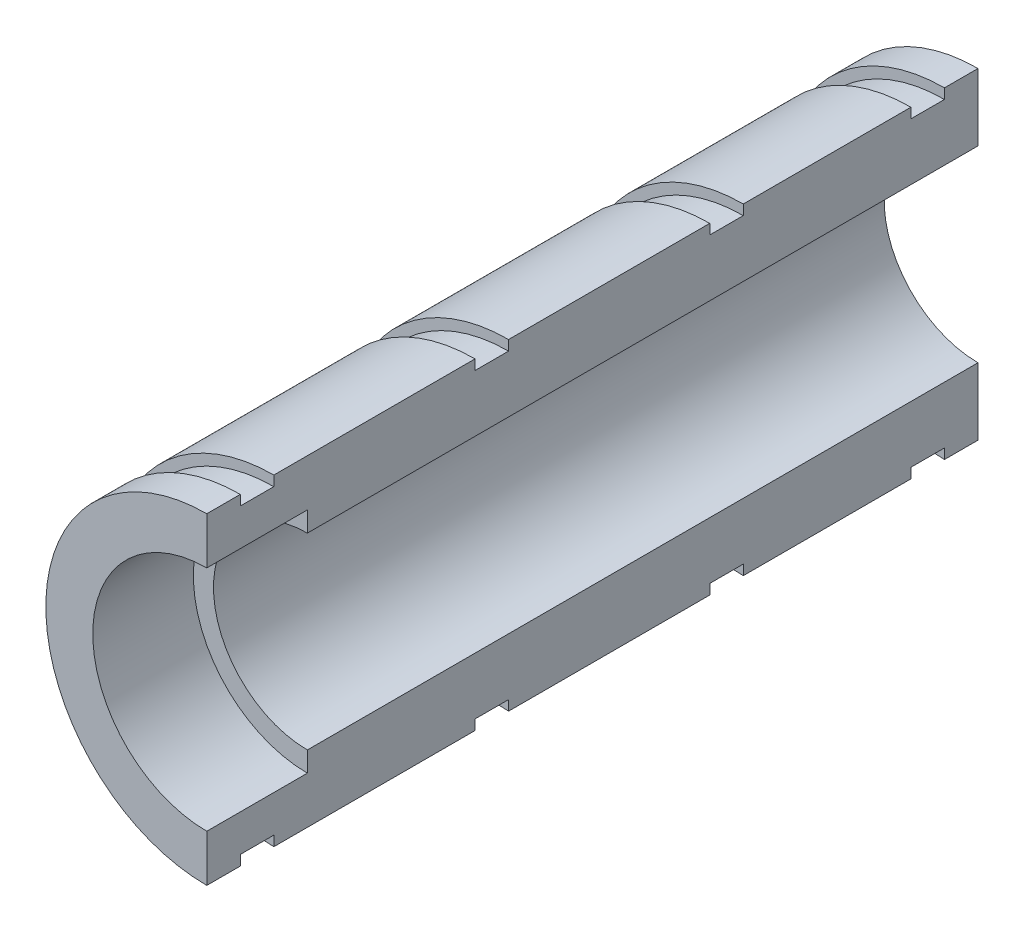
ISO-10303-21;
HEADER;
FILE_DESCRIPTION(('STEP AP214'),'2;1');
FILE_NAME('part.step','',(''),(''),'','','');
FILE_SCHEMA(('AUTOMOTIVE_DESIGN { 1 0 10303 214 1 1 1 1 }'));
ENDSEC;
DATA;
#1=APPLICATION_CONTEXT('core data for automotive mechanical design processes');
#2=APPLICATION_PROTOCOL_DEFINITION('international standard','automotive_design',2000,#1);
#3=PRODUCT_CONTEXT('',#1,'mechanical');
#4=PRODUCT('Part','Part','',(#3));
#5=PRODUCT_RELATED_PRODUCT_CATEGORY('part','',(#4));
#6=PRODUCT_DEFINITION_FORMATION('','',#4);
#7=PRODUCT_DEFINITION_CONTEXT('part definition',#1,'design');
#8=PRODUCT_DEFINITION('design','',#6,#7);
#9=PRODUCT_DEFINITION_SHAPE('','',#8);
#10=(LENGTH_UNIT() NAMED_UNIT(*) SI_UNIT(.MILLI.,.METRE.));
#11=(NAMED_UNIT(*) PLANE_ANGLE_UNIT() SI_UNIT($,.RADIAN.));
#12=(NAMED_UNIT(*) SI_UNIT($,.STERADIAN.) SOLID_ANGLE_UNIT());
#13=UNCERTAINTY_MEASURE_WITH_UNIT(LENGTH_MEASURE(1.E-05),#10,'distance_accuracy_value','');
#14=(GEOMETRIC_REPRESENTATION_CONTEXT(3) GLOBAL_UNCERTAINTY_ASSIGNED_CONTEXT((#13)) GLOBAL_UNIT_ASSIGNED_CONTEXT((#10,
#11,#12)) REPRESENTATION_CONTEXT('',''));
#15=CARTESIAN_POINT('',(0.,0.,0.));
#16=DIRECTION('',(0.,0.,1.));
#17=DIRECTION('',(1.,0.,0.));
#18=AXIS2_PLACEMENT_3D('',#15,#16,#17);
#19=CARTESIAN_POINT('',(0.,0.,115.));
#20=DIRECTION('',(0.,0.,-1.));
#21=DIRECTION('',(-1.,0.,0.));
#22=AXIS2_PLACEMENT_3D('',#19,#20,#21);
#23=CYLINDRICAL_SURFACE('',#22,24.);
#24=CARTESIAN_POINT('',(0.,0.,9.99999999999999));
#25=DIRECTION('',(0.,0.,-1.));
#26=DIRECTION('',(-1.,0.,0.));
#27=AXIS2_PLACEMENT_3D('',#24,#25,#26);
#28=CIRCLE('',#27,24.);
#29=CARTESIAN_POINT('',(0.,-24.,9.99999999999999));
#30=VERTEX_POINT('',#29);
#31=CARTESIAN_POINT('',(0.,24.,9.99999999999999));
#32=VERTEX_POINT('',#31);
#33=EDGE_CURVE('E192',#30,#32,#28,.T.);
#34=ORIENTED_EDGE('',*,*,#33,.F.);
#35=DIRECTION('',(0.,0.,-1.));
#36=VECTOR('',#35,1.);
#37=CARTESIAN_POINT('',(0.,-24.,115.));
#38=LINE('',#37,#36);
#39=CARTESIAN_POINT('',(0.,-24.,35.));
#40=VERTEX_POINT('',#39);
#41=EDGE_CURVE('E333',#30,#40,#38,.F.);
#42=ORIENTED_EDGE('',*,*,#41,.T.);
#43=CARTESIAN_POINT('',(0.,0.,35.));
#44=DIRECTION('',(0.,0.,-1.));
#45=DIRECTION('',(-1.,0.,0.));
#46=AXIS2_PLACEMENT_3D('',#43,#44,#45);
#47=CIRCLE('',#46,24.);
#48=CARTESIAN_POINT('',(0.,24.,35.));
#49=VERTEX_POINT('',#48);
#50=EDGE_CURVE('E285',#40,#49,#47,.T.);
#51=ORIENTED_EDGE('',*,*,#50,.T.);
#52=DIRECTION('',(0.,0.,-1.));
#53=VECTOR('',#52,1.);
#54=CARTESIAN_POINT('',(0.,24.,115.));
#55=LINE('',#54,#53);
#56=EDGE_CURVE('E341',#49,#32,#55,.T.);
#57=ORIENTED_EDGE('',*,*,#56,.T.);
#58=EDGE_LOOP('',(#34,#42,#51,#57));
#59=FACE_BOUND('',#58,.T.);
#60=ADVANCED_FACE('F39',(#59),#23,.T.);
#61=CARTESIAN_POINT('',(0.,0.,105.));
#62=DIRECTION('',(0.,0.,1.));
#63=DIRECTION('',(1.,0.,0.));
#64=AXIS2_PLACEMENT_3D('',#61,#62,#63);
#65=CIRCLE('',#64,24.);
#66=CARTESIAN_POINT('',(0.,24.,105.));
#67=VERTEX_POINT('',#66);
#68=CARTESIAN_POINT('',(0.,-24.,105.));
#69=VERTEX_POINT('',#68);
#70=EDGE_CURVE('E236',#67,#69,#65,.T.);
#71=ORIENTED_EDGE('',*,*,#70,.F.);
#72=CARTESIAN_POINT('',(0.,24.,75.));
#73=VERTEX_POINT('',#72);
#74=EDGE_CURVE('E340',#67,#73,#55,.T.);
#75=ORIENTED_EDGE('',*,*,#74,.T.);
#76=CARTESIAN_POINT('',(0.,0.,75.));
#77=DIRECTION('',(0.,0.,-1.));
#78=DIRECTION('',(-1.,0.,0.));
#79=AXIS2_PLACEMENT_3D('',#76,#77,#78);
#80=CIRCLE('',#79,24.);
#81=CARTESIAN_POINT('',(0.,-24.,75.));
#82=VERTEX_POINT('',#81);
#83=EDGE_CURVE('E268',#82,#73,#80,.T.);
#84=ORIENTED_EDGE('',*,*,#83,.F.);
#85=EDGE_CURVE('E413',#82,#69,#38,.F.);
#86=ORIENTED_EDGE('',*,*,#85,.T.);
#87=EDGE_LOOP('',(#71,#75,#84,#86));
#88=FACE_BOUND('',#87,.T.);
#89=ADVANCED_FACE('F424',(#88),#23,.T.);
#90=CARTESIAN_POINT('',(0.,24.,115.));
#91=VERTEX_POINT('',#90);
#92=CARTESIAN_POINT('',(0.,24.,110.));
#93=VERTEX_POINT('',#92);
#94=EDGE_CURVE('E335',#91,#93,#55,.T.);
#95=ORIENTED_EDGE('',*,*,#94,.T.);
#96=CARTESIAN_POINT('',(0.,0.,110.));
#97=DIRECTION('',(0.,0.,1.));
#98=DIRECTION('',(1.,0.,0.));
#99=AXIS2_PLACEMENT_3D('',#96,#97,#98);
#100=CIRCLE('',#99,24.);
#101=CARTESIAN_POINT('',(0.,-24.,110.));
#102=VERTEX_POINT('',#101);
#103=EDGE_CURVE('E242',#93,#102,#100,.T.);
#104=ORIENTED_EDGE('',*,*,#103,.T.);
#105=CARTESIAN_POINT('',(0.,-24.,115.));
#106=VERTEX_POINT('',#105);
#107=EDGE_CURVE('E327',#102,#106,#38,.F.);
#108=ORIENTED_EDGE('',*,*,#107,.T.);
#109=CARTESIAN_POINT('',(0.,0.,115.));
#110=DIRECTION('',(0.,0.,1.));
#111=DIRECTION('',(1.,0.,0.));
#112=AXIS2_PLACEMENT_3D('',#109,#110,#111);
#113=CIRCLE('',#112,24.);
#114=EDGE_CURVE('E346',#91,#106,#113,.T.);
#115=ORIENTED_EDGE('',*,*,#114,.F.);
#116=EDGE_LOOP('',(#95,#104,#108,#115));
#117=FACE_BOUND('',#116,.T.);
#118=ADVANCED_FACE('F465',(#117),#23,.T.);
#119=CARTESIAN_POINT('',(0.,27.3295987942674,-15.));
#120=DIRECTION('',(-1.,0.,0.));
#121=DIRECTION('',(0.,0.,1.));
#122=AXIS2_PLACEMENT_3D('',#119,#120,#121);
#123=PLANE('',#122);
#124=DIRECTION('',(0.,0.,1.));
#125=VECTOR('',#124,1.);
#126=CARTESIAN_POINT('',(0.,-22.5,5.));
#127=LINE('',#126,#125);
#128=CARTESIAN_POINT('',(0.,-22.5,10.));
#129=VERTEX_POINT('',#128);
#130=CARTESIAN_POINT('',(0.,-22.5,5.));
#131=VERTEX_POINT('',#130);
#132=EDGE_CURVE('E204',#129,#131,#127,.F.);
#133=ORIENTED_EDGE('',*,*,#132,.T.);
#134=DIRECTION('',(0.,-1.,0.));
#135=VECTOR('',#134,1.);
#136=CARTESIAN_POINT('',(0.,27.3295987942674,5.));
#137=LINE('',#136,#135);
#138=CARTESIAN_POINT('',(0.,-24.,5.));
#139=VERTEX_POINT('',#138);
#140=EDGE_CURVE('E216',#131,#139,#137,.T.);
#141=ORIENTED_EDGE('',*,*,#140,.T.);
#142=CARTESIAN_POINT('',(0.,-24.,0.));
#143=VERTEX_POINT('',#142);
#144=EDGE_CURVE('E329',#143,#139,#38,.F.);
#145=ORIENTED_EDGE('',*,*,#144,.F.);
#146=DIRECTION('',(0.,-1.,0.));
#147=VECTOR('',#146,1.);
#148=CARTESIAN_POINT('',(0.,0.,0.));
#149=LINE('',#148,#147);
#150=CARTESIAN_POINT('',(0.,-14.,0.));
#151=VERTEX_POINT('',#150);
#152=EDGE_CURVE('E323',#151,#143,#149,.T.);
#153=ORIENTED_EDGE('',*,*,#152,.F.);
#154=DIRECTION('',(0.,0.,-1.));
#155=VECTOR('',#154,1.);
#156=CARTESIAN_POINT('',(0.,-14.,115.));
#157=LINE('',#156,#155);
#158=CARTESIAN_POINT('',(0.,-14.,100.));
#159=VERTEX_POINT('',#158);
#160=EDGE_CURVE('E350',#151,#159,#157,.F.);
#161=ORIENTED_EDGE('',*,*,#160,.T.);
#162=DIRECTION('',(0.,1.,0.));
#163=VECTOR('',#162,1.);
#164=CARTESIAN_POINT('',(0.,27.3295987942674,100.));
#165=LINE('',#164,#163);
#166=CARTESIAN_POINT('',(0.,-17.,100.));
#167=VERTEX_POINT('',#166);
#168=EDGE_CURVE('E311',#167,#159,#165,.T.);
#169=ORIENTED_EDGE('',*,*,#168,.F.);
#170=DIRECTION('',(0.,0.,1.));
#171=VECTOR('',#170,1.);
#172=CARTESIAN_POINT('',(0.,-17.,100.));
#173=LINE('',#172,#171);
#174=CARTESIAN_POINT('',(0.,-17.,115.));
#175=VERTEX_POINT('',#174);
#176=EDGE_CURVE('E314',#167,#175,#173,.T.);
#177=ORIENTED_EDGE('',*,*,#176,.T.);
#178=DIRECTION('',(0.,-1.,0.));
#179=VECTOR('',#178,1.);
#180=CARTESIAN_POINT('',(0.,27.3295987942674,115.));
#181=LINE('',#180,#179);
#182=EDGE_CURVE('E318',#175,#106,#181,.T.);
#183=ORIENTED_EDGE('',*,*,#182,.T.);
#184=ORIENTED_EDGE('',*,*,#107,.F.);
#185=DIRECTION('',(0.,1.,0.));
#186=VECTOR('',#185,1.);
#187=CARTESIAN_POINT('',(0.,27.3295987942674,110.));
#188=LINE('',#187,#186);
#189=CARTESIAN_POINT('',(0.,-22.5,110.));
#190=VERTEX_POINT('',#189);
#191=EDGE_CURVE('E246',#102,#190,#188,.T.);
#192=ORIENTED_EDGE('',*,*,#191,.T.);
#193=DIRECTION('',(0.,0.,-1.));
#194=VECTOR('',#193,1.);
#195=CARTESIAN_POINT('',(0.,-22.5,110.));
#196=LINE('',#195,#194);
#197=CARTESIAN_POINT('',(0.,-22.5,105.));
#198=VERTEX_POINT('',#197);
#199=EDGE_CURVE('E229',#190,#198,#196,.T.);
#200=ORIENTED_EDGE('',*,*,#199,.T.);
#201=DIRECTION('',(0.,1.,0.));
#202=VECTOR('',#201,1.);
#203=CARTESIAN_POINT('',(0.,27.3295987942674,105.));
#204=LINE('',#203,#202);
#205=EDGE_CURVE('E239',#69,#198,#204,.T.);
#206=ORIENTED_EDGE('',*,*,#205,.F.);
#207=ORIENTED_EDGE('',*,*,#85,.F.);
#208=DIRECTION('',(0.,-1.,0.));
#209=VECTOR('',#208,1.);
#210=CARTESIAN_POINT('',(0.,27.3295987942674,75.));
#211=LINE('',#210,#209);
#212=CARTESIAN_POINT('',(0.,-22.5,75.));
#213=VERTEX_POINT('',#212);
#214=EDGE_CURVE('E272',#213,#82,#211,.T.);
#215=ORIENTED_EDGE('',*,*,#214,.F.);
#216=DIRECTION('',(0.,0.,-1.));
#217=VECTOR('',#216,1.);
#218=CARTESIAN_POINT('',(0.,-22.5,75.));
#219=LINE('',#218,#217);
#220=CARTESIAN_POINT('',(0.,-22.5,70.));
#221=VERTEX_POINT('',#220);
#222=EDGE_CURVE('E254',#221,#213,#219,.F.);
#223=ORIENTED_EDGE('',*,*,#222,.F.);
#224=DIRECTION('',(0.,-1.,0.));
#225=VECTOR('',#224,1.);
#226=CARTESIAN_POINT('',(0.,27.3295987942674,70.));
#227=LINE('',#226,#225);
#228=CARTESIAN_POINT('',(0.,-24.,70.));
#229=VERTEX_POINT('',#228);
#230=EDGE_CURVE('E264',#221,#229,#227,.T.);
#231=ORIENTED_EDGE('',*,*,#230,.T.);
#232=CARTESIAN_POINT('',(0.,-24.,40.));
#233=VERTEX_POINT('',#232);
#234=EDGE_CURVE('E334',#233,#229,#38,.F.);
#235=ORIENTED_EDGE('',*,*,#234,.F.);
#236=DIRECTION('',(0.,-1.,0.));
#237=VECTOR('',#236,1.);
#238=CARTESIAN_POINT('',(0.,27.3295987942674,40.));
#239=LINE('',#238,#237);
#240=CARTESIAN_POINT('',(0.,-22.5,40.));
#241=VERTEX_POINT('',#240);
#242=EDGE_CURVE('E297',#241,#233,#239,.T.);
#243=ORIENTED_EDGE('',*,*,#242,.F.);
#244=DIRECTION('',(0.,0.,-1.));
#245=VECTOR('',#244,1.);
#246=CARTESIAN_POINT('',(0.,-22.5,40.));
#247=LINE('',#246,#245);
#248=CARTESIAN_POINT('',(0.,-22.5,35.));
#249=VERTEX_POINT('',#248);
#250=EDGE_CURVE('E279',#249,#241,#247,.F.);
#251=ORIENTED_EDGE('',*,*,#250,.F.);
#252=DIRECTION('',(0.,-1.,0.));
#253=VECTOR('',#252,1.);
#254=CARTESIAN_POINT('',(0.,27.3295987942674,35.));
#255=LINE('',#254,#253);
#256=EDGE_CURVE('E289',#249,#40,#255,.T.);
#257=ORIENTED_EDGE('',*,*,#256,.T.);
#258=ORIENTED_EDGE('',*,*,#41,.F.);
#259=DIRECTION('',(0.,-1.,0.));
#260=VECTOR('',#259,1.);
#261=CARTESIAN_POINT('',(0.,27.3295987942674,10.));
#262=LINE('',#261,#260);
#263=EDGE_CURVE('E55',#129,#30,#262,.T.);
#264=ORIENTED_EDGE('',*,*,#263,.F.);
#265=EDGE_LOOP('',(#133,#141,#145,#153,#161,#169,#177,#183,#184,#192,#200,#206,#207,#215,#223,
#231,#235,#243,#251,#257,#258,#264));
#266=FACE_BOUND('',#265,.T.);
#267=ADVANCED_FACE('F405',(#266),#123,.F.);
#268=CARTESIAN_POINT('',(0.,24.,5.));
#269=VERTEX_POINT('',#268);
#270=CARTESIAN_POINT('',(0.,24.,0.));
#271=VERTEX_POINT('',#270);
#272=EDGE_CURVE('E212',#269,#271,#55,.T.);
#273=ORIENTED_EDGE('',*,*,#272,.F.);
#274=DIRECTION('',(0.,-1.,0.));
#275=VECTOR('',#274,1.);
#276=CARTESIAN_POINT('',(0.,27.3295987942674,5.));
#277=LINE('',#276,#275);
#278=CARTESIAN_POINT('',(0.,22.5,5.));
#279=VERTEX_POINT('',#278);
#280=EDGE_CURVE('E210',#269,#279,#277,.T.);
#281=ORIENTED_EDGE('',*,*,#280,.T.);
#282=DIRECTION('',(0.,0.,1.));
#283=VECTOR('',#282,1.);
#284=CARTESIAN_POINT('',(0.,22.5,5.));
#285=LINE('',#284,#283);
#286=CARTESIAN_POINT('',(0.,22.5,10.));
#287=VERTEX_POINT('',#286);
#288=EDGE_CURVE('E11',#279,#287,#285,.T.);
#289=ORIENTED_EDGE('',*,*,#288,.T.);
#290=DIRECTION('',(0.,-1.,0.));
#291=VECTOR('',#290,1.);
#292=CARTESIAN_POINT('',(0.,27.3295987942674,10.));
#293=LINE('',#292,#291);
#294=EDGE_CURVE('E188',#32,#287,#293,.T.);
#295=ORIENTED_EDGE('',*,*,#294,.F.);
#296=ORIENTED_EDGE('',*,*,#56,.F.);
#297=DIRECTION('',(0.,-1.,0.));
#298=VECTOR('',#297,1.);
#299=CARTESIAN_POINT('',(0.,27.3295987942674,35.));
#300=LINE('',#299,#298);
#301=CARTESIAN_POINT('',(0.,22.5,35.));
#302=VERTEX_POINT('',#301);
#303=EDGE_CURVE('E370',#49,#302,#300,.T.);
#304=ORIENTED_EDGE('',*,*,#303,.T.);
#305=DIRECTION('',(0.,0.,-1.));
#306=VECTOR('',#305,1.);
#307=CARTESIAN_POINT('',(0.,22.5,40.));
#308=LINE('',#307,#306);
#309=CARTESIAN_POINT('',(0.,22.5,40.));
#310=VERTEX_POINT('',#309);
#311=EDGE_CURVE('E367',#310,#302,#308,.T.);
#312=ORIENTED_EDGE('',*,*,#311,.F.);
#313=DIRECTION('',(0.,-1.,0.));
#314=VECTOR('',#313,1.);
#315=CARTESIAN_POINT('',(0.,27.3295987942674,40.));
#316=LINE('',#315,#314);
#317=CARTESIAN_POINT('',(0.,24.,40.));
#318=VERTEX_POINT('',#317);
#319=EDGE_CURVE('E374',#318,#310,#316,.T.);
#320=ORIENTED_EDGE('',*,*,#319,.F.);
#321=CARTESIAN_POINT('',(0.,24.,70.));
#322=VERTEX_POINT('',#321);
#323=EDGE_CURVE('E437',#322,#318,#55,.T.);
#324=ORIENTED_EDGE('',*,*,#323,.F.);
#325=DIRECTION('',(0.,-1.,0.));
#326=VECTOR('',#325,1.);
#327=CARTESIAN_POINT('',(0.,27.3295987942674,70.));
#328=LINE('',#327,#326);
#329=CARTESIAN_POINT('',(0.,22.5,70.));
#330=VERTEX_POINT('',#329);
#331=EDGE_CURVE('E381',#322,#330,#328,.T.);
#332=ORIENTED_EDGE('',*,*,#331,.T.);
#333=DIRECTION('',(0.,0.,-1.));
#334=VECTOR('',#333,1.);
#335=CARTESIAN_POINT('',(0.,22.5,75.));
#336=LINE('',#335,#334);
#337=CARTESIAN_POINT('',(0.,22.5,75.));
#338=VERTEX_POINT('',#337);
#339=EDGE_CURVE('E378',#338,#330,#336,.T.);
#340=ORIENTED_EDGE('',*,*,#339,.F.);
#341=DIRECTION('',(0.,-1.,0.));
#342=VECTOR('',#341,1.);
#343=CARTESIAN_POINT('',(0.,27.3295987942674,75.));
#344=LINE('',#343,#342);
#345=EDGE_CURVE('E385',#73,#338,#344,.T.);
#346=ORIENTED_EDGE('',*,*,#345,.F.);
#347=ORIENTED_EDGE('',*,*,#74,.F.);
#348=DIRECTION('',(0.,1.,0.));
#349=VECTOR('',#348,1.);
#350=CARTESIAN_POINT('',(0.,27.3295987942674,105.));
#351=LINE('',#350,#349);
#352=CARTESIAN_POINT('',(0.,22.5,105.));
#353=VERTEX_POINT('',#352);
#354=EDGE_CURVE('E393',#353,#67,#351,.T.);
#355=ORIENTED_EDGE('',*,*,#354,.F.);
#356=DIRECTION('',(0.,0.,-1.));
#357=VECTOR('',#356,1.);
#358=CARTESIAN_POINT('',(0.,22.5,110.));
#359=LINE('',#358,#357);
#360=CARTESIAN_POINT('',(0.,22.5,110.));
#361=VERTEX_POINT('',#360);
#362=EDGE_CURVE('E389',#353,#361,#359,.F.);
#363=ORIENTED_EDGE('',*,*,#362,.T.);
#364=DIRECTION('',(0.,1.,0.));
#365=VECTOR('',#364,1.);
#366=CARTESIAN_POINT('',(0.,27.3295987942674,110.));
#367=LINE('',#366,#365);
#368=EDGE_CURVE('E396',#361,#93,#367,.T.);
#369=ORIENTED_EDGE('',*,*,#368,.T.);
#370=ORIENTED_EDGE('',*,*,#94,.F.);
#371=CARTESIAN_POINT('',(0.,17.,115.));
#372=VERTEX_POINT('',#371);
#373=EDGE_CURVE('E322',#91,#372,#181,.T.);
#374=ORIENTED_EDGE('',*,*,#373,.T.);
#375=DIRECTION('',(0.,0.,1.));
#376=VECTOR('',#375,1.);
#377=CARTESIAN_POINT('',(0.,17.,100.));
#378=LINE('',#377,#376);
#379=CARTESIAN_POINT('',(0.,17.,100.));
#380=VERTEX_POINT('',#379);
#381=EDGE_CURVE('E363',#372,#380,#378,.F.);
#382=ORIENTED_EDGE('',*,*,#381,.T.);
#383=DIRECTION('',(0.,1.,0.));
#384=VECTOR('',#383,1.);
#385=CARTESIAN_POINT('',(0.,27.3295987942674,100.));
#386=LINE('',#385,#384);
#387=CARTESIAN_POINT('',(0.,14.,100.));
#388=VERTEX_POINT('',#387);
#389=EDGE_CURVE('E360',#388,#380,#386,.T.);
#390=ORIENTED_EDGE('',*,*,#389,.F.);
#391=DIRECTION('',(0.,0.,-1.));
#392=VECTOR('',#391,1.);
#393=CARTESIAN_POINT('',(0.,14.,115.));
#394=LINE('',#393,#392);
#395=CARTESIAN_POINT('',(0.,14.,0.));
#396=VERTEX_POINT('',#395);
#397=EDGE_CURVE('E357',#388,#396,#394,.T.);
#398=ORIENTED_EDGE('',*,*,#397,.T.);
#399=EDGE_CURVE('E328',#271,#396,#149,.T.);
#400=ORIENTED_EDGE('',*,*,#399,.F.);
#401=EDGE_LOOP('',(#273,#281,#289,#295,#296,#304,#312,#320,#324,#332,#340,#346,#347,#355,#363,
#369,#370,#374,#382,#390,#398,#400));
#402=FACE_BOUND('',#401,.T.);
#403=ADVANCED_FACE('F209',(#402),#123,.F.);
#404=ORIENTED_EDGE('',*,*,#234,.T.);
#405=CARTESIAN_POINT('',(0.,0.,70.));
#406=DIRECTION('',(0.,0.,-1.));
#407=DIRECTION('',(-1.,0.,0.));
#408=AXIS2_PLACEMENT_3D('',#405,#406,#407);
#409=CIRCLE('',#408,24.);
#410=EDGE_CURVE('E260',#229,#322,#409,.T.);
#411=ORIENTED_EDGE('',*,*,#410,.T.);
#412=ORIENTED_EDGE('',*,*,#323,.T.);
#413=CARTESIAN_POINT('',(0.,0.,40.));
#414=DIRECTION('',(0.,0.,-1.));
#415=DIRECTION('',(-1.,0.,0.));
#416=AXIS2_PLACEMENT_3D('',#413,#414,#415);
#417=CIRCLE('',#416,24.);
#418=EDGE_CURVE('E293',#233,#318,#417,.T.);
#419=ORIENTED_EDGE('',*,*,#418,.F.);
#420=EDGE_LOOP('',(#404,#411,#412,#419));
#421=FACE_BOUND('',#420,.T.);
#422=ADVANCED_FACE('F485',(#421),#23,.T.);
#423=CARTESIAN_POINT('',(0.,0.,115.));
#424=DIRECTION('',(0.,0.,-1.));
#425=DIRECTION('',(-1.,0.,0.));
#426=AXIS2_PLACEMENT_3D('',#423,#424,#425);
#427=CYLINDRICAL_SURFACE('',#426,14.);
#428=ORIENTED_EDGE('',*,*,#397,.F.);
#429=CARTESIAN_POINT('',(0.,0.,100.));
#430=DIRECTION('',(0.,0.,1.));
#431=DIRECTION('',(1.,0.,0.));
#432=AXIS2_PLACEMENT_3D('',#429,#430,#431);
#433=CIRCLE('',#432,14.);
#434=EDGE_CURVE('E305',#388,#159,#433,.T.);
#435=ORIENTED_EDGE('',*,*,#434,.T.);
#436=ORIENTED_EDGE('',*,*,#160,.F.);
#437=CARTESIAN_POINT('',(0.,0.,0.));
#438=DIRECTION('',(0.,0.,1.));
#439=DIRECTION('',(1.,0.,0.));
#440=AXIS2_PLACEMENT_3D('',#437,#438,#439);
#441=CIRCLE('',#440,14.);
#442=EDGE_CURVE('E339',#396,#151,#441,.T.);
#443=ORIENTED_EDGE('',*,*,#442,.F.);
#444=EDGE_LOOP('',(#428,#435,#436,#443));
#445=FACE_BOUND('',#444,.T.);
#446=ADVANCED_FACE('F450',(#445),#427,.F.);
#447=CARTESIAN_POINT('',(0.,0.,115.));
#448=DIRECTION('',(0.,0.,1.));
#449=DIRECTION('',(1.,0.,0.));
#450=AXIS2_PLACEMENT_3D('',#447,#448,#449);
#451=PLANE('',#450);
#452=CARTESIAN_POINT('',(0.,0.,115.));
#453=DIRECTION('',(0.,0.,1.));
#454=DIRECTION('',(1.,0.,0.));
#455=AXIS2_PLACEMENT_3D('',#452,#453,#454);
#456=CIRCLE('',#455,17.);
#457=EDGE_CURVE('E300',#372,#175,#456,.T.);
#458=ORIENTED_EDGE('',*,*,#457,.F.);
#459=ORIENTED_EDGE('',*,*,#373,.F.);
#460=ORIENTED_EDGE('',*,*,#114,.T.);
#461=ORIENTED_EDGE('',*,*,#182,.F.);
#462=EDGE_LOOP('',(#458,#459,#460,#461));
#463=FACE_BOUND('',#462,.T.);
#464=ADVANCED_FACE('F464',(#463),#451,.T.);
#465=CARTESIAN_POINT('',(0.,0.,0.));
#466=DIRECTION('',(0.,0.,1.));
#467=DIRECTION('',(1.,0.,0.));
#468=AXIS2_PLACEMENT_3D('',#465,#466,#467);
#469=PLANE('',#468);
#470=CARTESIAN_POINT('',(0.,0.,0.));
#471=DIRECTION('',(0.,0.,1.));
#472=DIRECTION('',(1.,0.,0.));
#473=AXIS2_PLACEMENT_3D('',#470,#471,#472);
#474=CIRCLE('',#473,24.);
#475=EDGE_CURVE('E345',#271,#143,#474,.T.);
#476=ORIENTED_EDGE('',*,*,#475,.F.);
#477=ORIENTED_EDGE('',*,*,#399,.T.);
#478=ORIENTED_EDGE('',*,*,#442,.T.);
#479=ORIENTED_EDGE('',*,*,#152,.T.);
#480=EDGE_LOOP('',(#476,#477,#478,#479));
#481=FACE_BOUND('',#480,.T.);
#482=ADVANCED_FACE('F446',(#481),#469,.F.);
#483=ORIENTED_EDGE('',*,*,#144,.T.);
#484=CARTESIAN_POINT('',(0.,0.,5.));
#485=DIRECTION('',(0.,0.,-1.));
#486=DIRECTION('',(-1.,0.,0.));
#487=AXIS2_PLACEMENT_3D('',#484,#485,#486);
#488=CIRCLE('',#487,24.);
#489=EDGE_CURVE('E48',#139,#269,#488,.T.);
#490=ORIENTED_EDGE('',*,*,#489,.T.);
#491=ORIENTED_EDGE('',*,*,#272,.T.);
#492=ORIENTED_EDGE('',*,*,#475,.T.);
#493=EDGE_LOOP('',(#483,#490,#491,#492));
#494=FACE_BOUND('',#493,.T.);
#495=ADVANCED_FACE('F41',(#494),#23,.T.);
#496=CARTESIAN_POINT('',(0.,0.,100.));
#497=DIRECTION('',(0.,0.,1.));
#498=DIRECTION('',(1.,0.,0.));
#499=AXIS2_PLACEMENT_3D('',#496,#497,#498);
#500=CYLINDRICAL_SURFACE('',#499,17.);
#501=CARTESIAN_POINT('',(0.,0.,100.));
#502=DIRECTION('',(0.,0.,1.));
#503=DIRECTION('',(1.,0.,0.));
#504=AXIS2_PLACEMENT_3D('',#501,#502,#503);
#505=CIRCLE('',#504,17.);
#506=EDGE_CURVE('E301',#380,#167,#505,.T.);
#507=ORIENTED_EDGE('',*,*,#506,.F.);
#508=ORIENTED_EDGE('',*,*,#381,.F.);
#509=ORIENTED_EDGE('',*,*,#457,.T.);
#510=ORIENTED_EDGE('',*,*,#176,.F.);
#511=EDGE_LOOP('',(#507,#508,#509,#510));
#512=FACE_BOUND('',#511,.T.);
#513=ADVANCED_FACE('F458',(#512),#500,.F.);
#514=CARTESIAN_POINT('',(0.,0.,100.));
#515=DIRECTION('',(0.,0.,1.));
#516=DIRECTION('',(1.,0.,0.));
#517=AXIS2_PLACEMENT_3D('',#514,#515,#516);
#518=PLANE('',#517);
#519=ORIENTED_EDGE('',*,*,#168,.T.);
#520=ORIENTED_EDGE('',*,*,#434,.F.);
#521=ORIENTED_EDGE('',*,*,#389,.T.);
#522=ORIENTED_EDGE('',*,*,#506,.T.);
#523=EDGE_LOOP('',(#519,#520,#521,#522));
#524=FACE_BOUND('',#523,.T.);
#525=ADVANCED_FACE('F454',(#524),#518,.T.);
#526=CARTESIAN_POINT('',(0.,0.,40.));
#527=DIRECTION('',(0.,0.,-1.));
#528=DIRECTION('',(-1.,0.,0.));
#529=AXIS2_PLACEMENT_3D('',#526,#527,#528);
#530=PLANE('',#529);
#531=ORIENTED_EDGE('',*,*,#242,.T.);
#532=ORIENTED_EDGE('',*,*,#418,.T.);
#533=ORIENTED_EDGE('',*,*,#319,.T.);
#534=CARTESIAN_POINT('',(0.,0.,40.));
#535=DIRECTION('',(0.,0.,-1.));
#536=DIRECTION('',(-1.,0.,0.));
#537=AXIS2_PLACEMENT_3D('',#534,#535,#536);
#538=CIRCLE('',#537,22.5);
#539=EDGE_CURVE('E276',#241,#310,#538,.T.);
#540=ORIENTED_EDGE('',*,*,#539,.F.);
#541=EDGE_LOOP('',(#531,#532,#533,#540));
#542=FACE_BOUND('',#541,.T.);
#543=ADVANCED_FACE('F538',(#542),#530,.T.);
#544=CARTESIAN_POINT('',(0.,0.,35.));
#545=DIRECTION('',(0.,0.,-1.));
#546=DIRECTION('',(-1.,0.,0.));
#547=AXIS2_PLACEMENT_3D('',#544,#545,#546);
#548=PLANE('',#547);
#549=CARTESIAN_POINT('',(0.,0.,35.));
#550=DIRECTION('',(0.,0.,-1.));
#551=DIRECTION('',(-1.,0.,0.));
#552=AXIS2_PLACEMENT_3D('',#549,#550,#551);
#553=CIRCLE('',#552,22.5);
#554=EDGE_CURVE('E275',#249,#302,#553,.T.);
#555=ORIENTED_EDGE('',*,*,#554,.T.);
#556=ORIENTED_EDGE('',*,*,#303,.F.);
#557=ORIENTED_EDGE('',*,*,#50,.F.);
#558=ORIENTED_EDGE('',*,*,#256,.F.);
#559=EDGE_LOOP('',(#555,#556,#557,#558));
#560=FACE_BOUND('',#559,.T.);
#561=ADVANCED_FACE('F551',(#560),#548,.F.);
#562=CARTESIAN_POINT('',(0.,0.,40.));
#563=DIRECTION('',(0.,0.,-1.));
#564=DIRECTION('',(-1.,0.,0.));
#565=AXIS2_PLACEMENT_3D('',#562,#563,#564);
#566=CYLINDRICAL_SURFACE('',#565,22.5);
#567=ORIENTED_EDGE('',*,*,#250,.T.);
#568=ORIENTED_EDGE('',*,*,#539,.T.);
#569=ORIENTED_EDGE('',*,*,#311,.T.);
#570=ORIENTED_EDGE('',*,*,#554,.F.);
#571=EDGE_LOOP('',(#567,#568,#569,#570));
#572=FACE_BOUND('',#571,.T.);
#573=ADVANCED_FACE('F560',(#572),#566,.T.);
#574=CARTESIAN_POINT('',(0.,0.,75.));
#575=DIRECTION('',(0.,0.,-1.));
#576=DIRECTION('',(-1.,0.,0.));
#577=AXIS2_PLACEMENT_3D('',#574,#575,#576);
#578=PLANE('',#577);
#579=ORIENTED_EDGE('',*,*,#214,.T.);
#580=ORIENTED_EDGE('',*,*,#83,.T.);
#581=ORIENTED_EDGE('',*,*,#345,.T.);
#582=CARTESIAN_POINT('',(0.,0.,75.));
#583=DIRECTION('',(0.,0.,-1.));
#584=DIRECTION('',(-1.,0.,0.));
#585=AXIS2_PLACEMENT_3D('',#582,#583,#584);
#586=CIRCLE('',#585,22.5);
#587=EDGE_CURVE('E251',#213,#338,#586,.T.);
#588=ORIENTED_EDGE('',*,*,#587,.F.);
#589=EDGE_LOOP('',(#579,#580,#581,#588));
#590=FACE_BOUND('',#589,.T.);
#591=ADVANCED_FACE('F568',(#590),#578,.T.);
#592=CARTESIAN_POINT('',(0.,0.,70.));
#593=DIRECTION('',(0.,0.,-1.));
#594=DIRECTION('',(-1.,0.,0.));
#595=AXIS2_PLACEMENT_3D('',#592,#593,#594);
#596=PLANE('',#595);
#597=CARTESIAN_POINT('',(0.,0.,70.));
#598=DIRECTION('',(0.,0.,-1.));
#599=DIRECTION('',(-1.,0.,0.));
#600=AXIS2_PLACEMENT_3D('',#597,#598,#599);
#601=CIRCLE('',#600,22.5);
#602=EDGE_CURVE('E250',#221,#330,#601,.T.);
#603=ORIENTED_EDGE('',*,*,#602,.T.);
#604=ORIENTED_EDGE('',*,*,#331,.F.);
#605=ORIENTED_EDGE('',*,*,#410,.F.);
#606=ORIENTED_EDGE('',*,*,#230,.F.);
#607=EDGE_LOOP('',(#603,#604,#605,#606));
#608=FACE_BOUND('',#607,.T.);
#609=ADVANCED_FACE('F476',(#608),#596,.F.);
#610=CARTESIAN_POINT('',(0.,0.,75.));
#611=DIRECTION('',(0.,0.,-1.));
#612=DIRECTION('',(-1.,0.,0.));
#613=AXIS2_PLACEMENT_3D('',#610,#611,#612);
#614=CYLINDRICAL_SURFACE('',#613,22.5);
#615=ORIENTED_EDGE('',*,*,#222,.T.);
#616=ORIENTED_EDGE('',*,*,#587,.T.);
#617=ORIENTED_EDGE('',*,*,#339,.T.);
#618=ORIENTED_EDGE('',*,*,#602,.F.);
#619=EDGE_LOOP('',(#615,#616,#617,#618));
#620=FACE_BOUND('',#619,.T.);
#621=ADVANCED_FACE('F469',(#620),#614,.T.);
#622=CARTESIAN_POINT('',(0.,0.,110.));
#623=DIRECTION('',(0.,0.,1.));
#624=DIRECTION('',(1.,0.,0.));
#625=AXIS2_PLACEMENT_3D('',#622,#623,#624);
#626=PLANE('',#625);
#627=ORIENTED_EDGE('',*,*,#103,.F.);
#628=ORIENTED_EDGE('',*,*,#368,.F.);
#629=CARTESIAN_POINT('',(0.,0.,110.));
#630=DIRECTION('',(0.,0.,1.));
#631=DIRECTION('',(1.,0.,0.));
#632=AXIS2_PLACEMENT_3D('',#629,#630,#631);
#633=CIRCLE('',#632,22.5);
#634=EDGE_CURVE('E63',#361,#190,#633,.T.);
#635=ORIENTED_EDGE('',*,*,#634,.T.);
#636=ORIENTED_EDGE('',*,*,#191,.F.);
#637=EDGE_LOOP('',(#627,#628,#635,#636));
#638=FACE_BOUND('',#637,.T.);
#639=ADVANCED_FACE('F467',(#638),#626,.F.);
#640=CARTESIAN_POINT('',(0.,0.,105.));
#641=DIRECTION('',(0.,0.,1.));
#642=DIRECTION('',(1.,0.,0.));
#643=AXIS2_PLACEMENT_3D('',#640,#641,#642);
#644=PLANE('',#643);
#645=ORIENTED_EDGE('',*,*,#205,.T.);
#646=CARTESIAN_POINT('',(0.,0.,105.));
#647=DIRECTION('',(0.,0.,1.));
#648=DIRECTION('',(1.,0.,0.));
#649=AXIS2_PLACEMENT_3D('',#646,#647,#648);
#650=CIRCLE('',#649,22.5);
#651=EDGE_CURVE('E226',#353,#198,#650,.T.);
#652=ORIENTED_EDGE('',*,*,#651,.F.);
#653=ORIENTED_EDGE('',*,*,#354,.T.);
#654=ORIENTED_EDGE('',*,*,#70,.T.);
#655=EDGE_LOOP('',(#645,#652,#653,#654));
#656=FACE_BOUND('',#655,.T.);
#657=ADVANCED_FACE('F431',(#656),#644,.T.);
#658=CARTESIAN_POINT('',(0.,0.,110.));
#659=DIRECTION('',(0.,0.,-1.));
#660=DIRECTION('',(-1.,0.,0.));
#661=AXIS2_PLACEMENT_3D('',#658,#659,#660);
#662=CYLINDRICAL_SURFACE('',#661,22.5);
#663=ORIENTED_EDGE('',*,*,#634,.F.);
#664=ORIENTED_EDGE('',*,*,#362,.F.);
#665=ORIENTED_EDGE('',*,*,#651,.T.);
#666=ORIENTED_EDGE('',*,*,#199,.F.);
#667=EDGE_LOOP('',(#663,#664,#665,#666));
#668=FACE_BOUND('',#667,.T.);
#669=ADVANCED_FACE('F433',(#668),#662,.T.);
#670=CARTESIAN_POINT('',(0.,0.,5.));
#671=DIRECTION('',(0.,0.,1.));
#672=DIRECTION('',(1.,0.,0.));
#673=AXIS2_PLACEMENT_3D('',#670,#671,#672);
#674=CYLINDRICAL_SURFACE('',#673,22.5);
#675=CARTESIAN_POINT('',(0.,0.,10.));
#676=DIRECTION('',(0.,0.,-1.));
#677=DIRECTION('',(-1.,0.,0.));
#678=AXIS2_PLACEMENT_3D('',#675,#676,#677);
#679=CIRCLE('',#678,22.5);
#680=EDGE_CURVE('E191',#129,#287,#679,.T.);
#681=ORIENTED_EDGE('',*,*,#680,.T.);
#682=ORIENTED_EDGE('',*,*,#288,.F.);
#683=CARTESIAN_POINT('',(0.,0.,5.));
#684=DIRECTION('',(0.,0.,-1.));
#685=DIRECTION('',(-1.,0.,0.));
#686=AXIS2_PLACEMENT_3D('',#683,#684,#685);
#687=CIRCLE('',#686,22.5);
#688=EDGE_CURVE('E197',#131,#279,#687,.T.);
#689=ORIENTED_EDGE('',*,*,#688,.F.);
#690=ORIENTED_EDGE('',*,*,#132,.F.);
#691=EDGE_LOOP('',(#681,#682,#689,#690));
#692=FACE_BOUND('',#691,.T.);
#693=ADVANCED_FACE('F200',(#692),#674,.T.);
#694=CARTESIAN_POINT('',(0.,0.,5.));
#695=DIRECTION('',(0.,0.,-1.));
#696=DIRECTION('',(-1.,0.,0.));
#697=AXIS2_PLACEMENT_3D('',#694,#695,#696);
#698=PLANE('',#697);
#699=ORIENTED_EDGE('',*,*,#688,.T.);
#700=ORIENTED_EDGE('',*,*,#280,.F.);
#701=ORIENTED_EDGE('',*,*,#489,.F.);
#702=ORIENTED_EDGE('',*,*,#140,.F.);
#703=EDGE_LOOP('',(#699,#700,#701,#702));
#704=FACE_BOUND('',#703,.T.);
#705=ADVANCED_FACE('F403',(#704),#698,.F.);
#706=CARTESIAN_POINT('',(0.,0.,10.));
#707=DIRECTION('',(0.,0.,-1.));
#708=DIRECTION('',(-1.,0.,0.));
#709=AXIS2_PLACEMENT_3D('',#706,#707,#708);
#710=PLANE('',#709);
#711=ORIENTED_EDGE('',*,*,#263,.T.);
#712=ORIENTED_EDGE('',*,*,#33,.T.);
#713=ORIENTED_EDGE('',*,*,#294,.T.);
#714=ORIENTED_EDGE('',*,*,#680,.F.);
#715=EDGE_LOOP('',(#711,#712,#713,#714));
#716=FACE_BOUND('',#715,.T.);
#717=ADVANCED_FACE('F190',(#716),#710,.T.);
#718=CLOSED_SHELL('',(#60,#89,#118,#267,#403,#422,#446,#464,#482,#495,#513,#525,#543,#561,#573,
#591,#609,#621,#639,#657,#669,#693,#705,#717));
#719=MANIFOLD_SOLID_BREP('B2',#718);
#720=ADVANCED_BREP_SHAPE_REPRESENTATION('',(#18,#719),#14);
#721=SHAPE_DEFINITION_REPRESENTATION(#9,#720);
ENDSEC;
END-ISO-10303-21;
